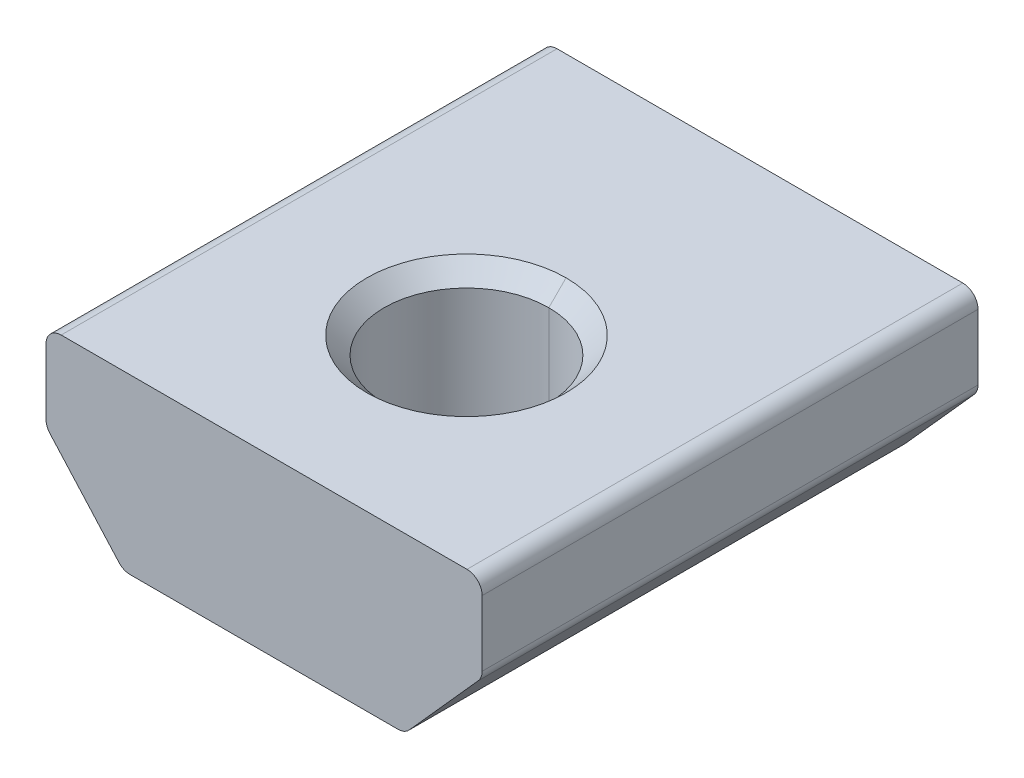
ISO-10303-21;
HEADER;
FILE_DESCRIPTION(('STEP AP214'),'2;1');
FILE_NAME('part.step','',(''),(''),'','','');
FILE_SCHEMA(('AUTOMOTIVE_DESIGN { 1 0 10303 214 1 1 1 1 }'));
ENDSEC;
DATA;
#1=APPLICATION_CONTEXT('core data for automotive mechanical design processes');
#2=APPLICATION_PROTOCOL_DEFINITION('international standard','automotive_design',2000,#1);
#3=PRODUCT_CONTEXT('',#1,'mechanical');
#4=PRODUCT('Part','Part','',(#3));
#5=PRODUCT_RELATED_PRODUCT_CATEGORY('part','',(#4));
#6=PRODUCT_DEFINITION_FORMATION('','',#4);
#7=PRODUCT_DEFINITION_CONTEXT('part definition',#1,'design');
#8=PRODUCT_DEFINITION('design','',#6,#7);
#9=PRODUCT_DEFINITION_SHAPE('','',#8);
#10=(LENGTH_UNIT() NAMED_UNIT(*) SI_UNIT(.MILLI.,.METRE.));
#11=(NAMED_UNIT(*) PLANE_ANGLE_UNIT() SI_UNIT($,.RADIAN.));
#12=(NAMED_UNIT(*) SI_UNIT($,.STERADIAN.) SOLID_ANGLE_UNIT());
#13=UNCERTAINTY_MEASURE_WITH_UNIT(LENGTH_MEASURE(1.E-05),#10,'distance_accuracy_value','');
#14=(GEOMETRIC_REPRESENTATION_CONTEXT(3) GLOBAL_UNCERTAINTY_ASSIGNED_CONTEXT((#13)) GLOBAL_UNIT_ASSIGNED_CONTEXT((#10,
#11,#12)) REPRESENTATION_CONTEXT('',''));
#15=CARTESIAN_POINT('',(0.,0.,0.));
#16=DIRECTION('',(0.,0.,1.));
#17=DIRECTION('',(1.,0.,0.));
#18=AXIS2_PLACEMENT_3D('',#15,#16,#17);
#19=CARTESIAN_POINT('',(5.0927,4.3434,5.08));
#20=DIRECTION('',(0.,-1.,0.));
#21=DIRECTION('',(0.,0.,-1.));
#22=AXIS2_PLACEMENT_3D('',#19,#20,#21);
#23=PLANE('',#22);
#24=CARTESIAN_POINT('',(0.,4.3434,0.));
#25=DIRECTION('',(0.,-1.,0.));
#26=DIRECTION('',(0.,0.,-1.));
#27=AXIS2_PLACEMENT_3D('',#24,#25,#26);
#28=CIRCLE('',#27,2.5);
#29=CARTESIAN_POINT('',(0.,4.3434,-2.5));
#30=VERTEX_POINT('',#29);
#31=CARTESIAN_POINT('',(0.,4.3434,2.5));
#32=VERTEX_POINT('',#31);
#33=EDGE_CURVE('E11',#30,#32,#28,.T.);
#34=ORIENTED_EDGE('',*,*,#33,.T.);
#35=CARTESIAN_POINT('',(0.,4.3434,0.));
#36=DIRECTION('',(0.,-1.,0.));
#37=DIRECTION('',(0.,0.,-1.));
#38=AXIS2_PLACEMENT_3D('',#35,#36,#37);
#39=CIRCLE('',#38,2.5);
#40=EDGE_CURVE('E25',#32,#30,#39,.T.);
#41=ORIENTED_EDGE('',*,*,#40,.T.);
#42=EDGE_LOOP('',(#34,#41));
#43=FACE_BOUND('',#42,.T.);
#44=DIRECTION('',(-1.,0.,0.));
#45=VECTOR('',#44,1.);
#46=CARTESIAN_POINT('',(5.0927,4.3434,-7.366));
#47=LINE('',#46,#45);
#48=CARTESIAN_POINT('',(5.0927,4.3434,-7.366));
#49=VERTEX_POINT('',#48);
#50=CARTESIAN_POINT('',(-5.0927,4.3434,-7.366));
#51=VERTEX_POINT('',#50);
#52=EDGE_CURVE('E356',#49,#51,#47,.T.);
#53=ORIENTED_EDGE('',*,*,#52,.T.);
#54=DIRECTION('',(0.,0.,-1.));
#55=VECTOR('',#54,1.);
#56=CARTESIAN_POINT('',(-5.0927,4.3434,5.08));
#57=LINE('',#56,#55);
#58=CARTESIAN_POINT('',(-5.0927,4.3434,5.08));
#59=VERTEX_POINT('',#58);
#60=EDGE_CURVE('E351',#59,#51,#57,.T.);
#61=ORIENTED_EDGE('',*,*,#60,.F.);
#62=DIRECTION('',(-1.,0.,0.));
#63=VECTOR('',#62,1.);
#64=CARTESIAN_POINT('',(5.0927,4.3434,5.08));
#65=LINE('',#64,#63);
#66=CARTESIAN_POINT('',(5.0927,4.3434,5.08));
#67=VERTEX_POINT('',#66);
#68=EDGE_CURVE('E346',#67,#59,#65,.T.);
#69=ORIENTED_EDGE('',*,*,#68,.F.);
#70=DIRECTION('',(0.,0.,-1.));
#71=VECTOR('',#70,1.);
#72=CARTESIAN_POINT('',(5.0927,4.3434,5.08));
#73=LINE('',#72,#71);
#74=EDGE_CURVE('E342',#67,#49,#73,.T.);
#75=ORIENTED_EDGE('',*,*,#74,.T.);
#76=EDGE_LOOP('',(#53,#61,#69,#75));
#77=FACE_BOUND('',#76,.T.);
#78=ADVANCED_FACE('F17',(#43,#77),#23,.F.);
#79=CARTESIAN_POINT('',(5.09270000000009,3.96240000000009,5.08));
#80=DIRECTION('',(0.,0.,1.));
#81=DIRECTION('',(-0.707106781186547,-0.707106781186548,0.));
#82=AXIS2_PLACEMENT_3D('',#79,#80,#81);
#83=CYLINDRICAL_SURFACE('',#82,0.381);
#84=CARTESIAN_POINT('',(5.09270000000009,3.96240000000009,-7.366));
#85=DIRECTION('',(0.,0.,1.));
#86=DIRECTION('',(1.,0.,0.));
#87=AXIS2_PLACEMENT_3D('',#84,#85,#86);
#88=CIRCLE('',#87,0.381);
#89=CARTESIAN_POINT('',(5.4737,3.9624,-7.366));
#90=VERTEX_POINT('',#89);
#91=EDGE_CURVE('E337',#90,#49,#88,.T.);
#92=ORIENTED_EDGE('',*,*,#91,.T.);
#93=ORIENTED_EDGE('',*,*,#74,.F.);
#94=CARTESIAN_POINT('',(5.09270000000009,3.96240000000009,5.08));
#95=DIRECTION('',(0.,0.,1.));
#96=DIRECTION('',(1.,0.,0.));
#97=AXIS2_PLACEMENT_3D('',#94,#95,#96);
#98=CIRCLE('',#97,0.381);
#99=CARTESIAN_POINT('',(5.4737,3.9624,5.08));
#100=VERTEX_POINT('',#99);
#101=EDGE_CURVE('E332',#100,#67,#98,.T.);
#102=ORIENTED_EDGE('',*,*,#101,.F.);
#103=DIRECTION('',(0.,0.,-1.));
#104=VECTOR('',#103,1.);
#105=CARTESIAN_POINT('',(5.4737,3.9624,5.08));
#106=LINE('',#105,#104);
#107=EDGE_CURVE('E328',#100,#90,#106,.T.);
#108=ORIENTED_EDGE('',*,*,#107,.T.);
#109=EDGE_LOOP('',(#92,#93,#102,#108));
#110=FACE_BOUND('',#109,.T.);
#111=ADVANCED_FACE('F384',(#110),#83,.T.);
#112=CARTESIAN_POINT('',(5.4737,2.3172659511594,5.08));
#113=DIRECTION('',(-1.,0.,0.));
#114=DIRECTION('',(0.,0.,1.));
#115=AXIS2_PLACEMENT_3D('',#112,#113,#114);
#116=PLANE('',#115);
#117=DIRECTION('',(0.,1.,0.));
#118=VECTOR('',#117,1.);
#119=CARTESIAN_POINT('',(5.4737,2.3172659511594,-7.366));
#120=LINE('',#119,#118);
#121=CARTESIAN_POINT('',(5.4737,2.3172659511594,-7.366));
#122=VERTEX_POINT('',#121);
#123=EDGE_CURVE('E323',#122,#90,#120,.T.);
#124=ORIENTED_EDGE('',*,*,#123,.T.);
#125=ORIENTED_EDGE('',*,*,#107,.F.);
#126=DIRECTION('',(0.,1.,0.));
#127=VECTOR('',#126,1.);
#128=CARTESIAN_POINT('',(5.4737,2.3172659511594,5.08));
#129=LINE('',#128,#127);
#130=CARTESIAN_POINT('',(5.4737,2.3172659511594,5.08));
#131=VERTEX_POINT('',#130);
#132=EDGE_CURVE('E318',#131,#100,#129,.T.);
#133=ORIENTED_EDGE('',*,*,#132,.F.);
#134=DIRECTION('',(0.,0.,-1.));
#135=VECTOR('',#134,1.);
#136=CARTESIAN_POINT('',(5.4737,2.3172659511594,5.08));
#137=LINE('',#136,#135);
#138=EDGE_CURVE('E314',#131,#122,#137,.T.);
#139=ORIENTED_EDGE('',*,*,#138,.T.);
#140=EDGE_LOOP('',(#124,#125,#133,#139));
#141=FACE_BOUND('',#140,.T.);
#142=ADVANCED_FACE('F390',(#141),#116,.F.);
#143=CARTESIAN_POINT('',(5.09270000000063,2.31726595115922,5.08));
#144=DIRECTION('',(0.,0.,1.));
#145=DIRECTION('',(-0.934142197565999,0.356901043325129,0.));
#146=AXIS2_PLACEMENT_3D('',#143,#144,#145);
#147=CYLINDRICAL_SURFACE('',#146,0.381);
#148=CARTESIAN_POINT('',(5.09270000000063,2.31726595115922,-7.366));
#149=DIRECTION('',(0.,0.,1.));
#150=DIRECTION('',(1.,0.,0.));
#151=AXIS2_PLACEMENT_3D('',#148,#149,#150);
#152=CIRCLE('',#151,0.381);
#153=CARTESIAN_POINT('',(5.3766376936984,2.0632179515664,-7.366));
#154=VERTEX_POINT('',#153);
#155=EDGE_CURVE('E309',#154,#122,#152,.T.);
#156=ORIENTED_EDGE('',*,*,#155,.T.);
#157=ORIENTED_EDGE('',*,*,#138,.F.);
#158=CARTESIAN_POINT('',(5.09270000000063,2.31726595115922,5.08));
#159=DIRECTION('',(0.,0.,1.));
#160=DIRECTION('',(1.,0.,0.));
#161=AXIS2_PLACEMENT_3D('',#158,#159,#160);
#162=CIRCLE('',#161,0.381);
#163=CARTESIAN_POINT('',(5.3766376936984,2.0632179515664,5.08));
#164=VERTEX_POINT('',#163);
#165=EDGE_CURVE('E304',#164,#131,#162,.T.);
#166=ORIENTED_EDGE('',*,*,#165,.F.);
#167=DIRECTION('',(0.,0.,-1.));
#168=VECTOR('',#167,1.);
#169=CARTESIAN_POINT('',(5.3766376936984,2.0632179515664,5.08));
#170=LINE('',#169,#168);
#171=EDGE_CURVE('E300',#164,#154,#170,.T.);
#172=ORIENTED_EDGE('',*,*,#171,.T.);
#173=EDGE_LOOP('',(#156,#157,#166,#172));
#174=FACE_BOUND('',#173,.T.);
#175=ADVANCED_FACE('F393',(#174),#147,.T.);
#176=CARTESIAN_POINT('',(3.6441995479741,0.12695200040697,5.08));
#177=DIRECTION('',(-0.745243290547055,0.666792649850459,0.));
#178=DIRECTION('',(-0.666792649850459,-0.745243290547055,0.));
#179=AXIS2_PLACEMENT_3D('',#176,#177,#178);
#180=PLANE('',#179);
#181=DIRECTION('',(0.666792649850459,0.745243290547055,0.));
#182=VECTOR('',#181,1.);
#183=CARTESIAN_POINT('',(3.6441995479741,0.12695200040697,-7.366));
#184=LINE('',#183,#182);
#185=CARTESIAN_POINT('',(3.6441995479741,0.12695200040697,-7.366));
#186=VERTEX_POINT('',#185);
#187=EDGE_CURVE('E295',#186,#154,#184,.T.);
#188=ORIENTED_EDGE('',*,*,#187,.T.);
#189=ORIENTED_EDGE('',*,*,#171,.F.);
#190=DIRECTION('',(0.666792649850459,0.745243290547055,0.));
#191=VECTOR('',#190,1.);
#192=CARTESIAN_POINT('',(3.6441995479741,0.12695200040697,5.08));
#193=LINE('',#192,#191);
#194=CARTESIAN_POINT('',(3.6441995479741,0.12695200040697,5.08));
#195=VERTEX_POINT('',#194);
#196=EDGE_CURVE('E290',#195,#164,#193,.T.);
#197=ORIENTED_EDGE('',*,*,#196,.F.);
#198=DIRECTION('',(0.,0.,-1.));
#199=VECTOR('',#198,1.);
#200=CARTESIAN_POINT('',(3.6441995479741,0.12695200040697,5.08));
#201=LINE('',#200,#199);
#202=EDGE_CURVE('E286',#195,#186,#201,.T.);
#203=ORIENTED_EDGE('',*,*,#202,.T.);
#204=EDGE_LOOP('',(#188,#189,#197,#203));
#205=FACE_BOUND('',#204,.T.);
#206=ADVANCED_FACE('F396',(#205),#180,.F.);
#207=CARTESIAN_POINT('',(3.36026185427575,0.380999999999828,5.08));
#208=DIRECTION('',(0.,0.,1.));
#209=DIRECTION('',(-0.408171134543824,0.912905430439105,0.));
#210=AXIS2_PLACEMENT_3D('',#207,#208,#209);
#211=CYLINDRICAL_SURFACE('',#210,0.381);
#212=CARTESIAN_POINT('',(3.36026185427575,0.380999999999828,-7.366));
#213=DIRECTION('',(0.,0.,1.));
#214=DIRECTION('',(1.,0.,0.));
#215=AXIS2_PLACEMENT_3D('',#212,#213,#214);
#216=CIRCLE('',#215,0.381);
#217=CARTESIAN_POINT('',(3.3602618542757,0.,-7.366));
#218=VERTEX_POINT('',#217);
#219=EDGE_CURVE('E281',#218,#186,#216,.T.);
#220=ORIENTED_EDGE('',*,*,#219,.T.);
#221=ORIENTED_EDGE('',*,*,#202,.F.);
#222=CARTESIAN_POINT('',(3.36026185427575,0.380999999999828,5.08));
#223=DIRECTION('',(0.,0.,1.));
#224=DIRECTION('',(1.,0.,0.));
#225=AXIS2_PLACEMENT_3D('',#222,#223,#224);
#226=CIRCLE('',#225,0.381);
#227=CARTESIAN_POINT('',(3.3602618542757,0.,5.08));
#228=VERTEX_POINT('',#227);
#229=EDGE_CURVE('E276',#228,#195,#226,.T.);
#230=ORIENTED_EDGE('',*,*,#229,.F.);
#231=DIRECTION('',(0.,0.,-1.));
#232=VECTOR('',#231,1.);
#233=CARTESIAN_POINT('',(3.3602618542757,0.,5.08));
#234=LINE('',#233,#232);
#235=EDGE_CURVE('E272',#228,#218,#234,.T.);
#236=ORIENTED_EDGE('',*,*,#235,.T.);
#237=EDGE_LOOP('',(#220,#221,#230,#236));
#238=FACE_BOUND('',#237,.T.);
#239=ADVANCED_FACE('F402',(#238),#211,.T.);
#240=CARTESIAN_POINT('',(-3.3602618542757,0.,5.08));
#241=DIRECTION('',(0.,1.,0.));
#242=DIRECTION('',(0.,0.,1.));
#243=AXIS2_PLACEMENT_3D('',#240,#241,#242);
#244=PLANE('',#243);
#245=CARTESIAN_POINT('',(0.,0.,0.));
#246=DIRECTION('',(0.,-1.,0.));
#247=DIRECTION('',(0.,0.,-1.));
#248=AXIS2_PLACEMENT_3D('',#245,#246,#247);
#249=CIRCLE('',#248,2.5);
#250=CARTESIAN_POINT('',(0.,0.,-2.5));
#251=VERTEX_POINT('',#250);
#252=CARTESIAN_POINT('',(0.,1.10494946525819E-12,2.5000000000011));
#253=VERTEX_POINT('',#252);
#254=EDGE_CURVE('E267',#251,#253,#249,.T.);
#255=ORIENTED_EDGE('',*,*,#254,.F.);
#256=CARTESIAN_POINT('',(0.,0.,0.));
#257=DIRECTION('',(0.,-1.,0.));
#258=DIRECTION('',(0.,0.,-1.));
#259=AXIS2_PLACEMENT_3D('',#256,#257,#258);
#260=CIRCLE('',#259,2.5);
#261=EDGE_CURVE('E262',#253,#251,#260,.T.);
#262=ORIENTED_EDGE('',*,*,#261,.F.);
#263=EDGE_LOOP('',(#255,#262));
#264=FACE_BOUND('',#263,.T.);
#265=DIRECTION('',(1.,0.,0.));
#266=VECTOR('',#265,1.);
#267=CARTESIAN_POINT('',(-3.3602618542757,0.,-7.366));
#268=LINE('',#267,#266);
#269=CARTESIAN_POINT('',(-3.3602618542757,0.,-7.366));
#270=VERTEX_POINT('',#269);
#271=EDGE_CURVE('E257',#270,#218,#268,.T.);
#272=ORIENTED_EDGE('',*,*,#271,.T.);
#273=ORIENTED_EDGE('',*,*,#235,.F.);
#274=DIRECTION('',(1.,0.,0.));
#275=VECTOR('',#274,1.);
#276=CARTESIAN_POINT('',(-3.3602618542757,0.,5.08));
#277=LINE('',#276,#275);
#278=CARTESIAN_POINT('',(-3.3602618542757,0.,5.08));
#279=VERTEX_POINT('',#278);
#280=EDGE_CURVE('E252',#279,#228,#277,.T.);
#281=ORIENTED_EDGE('',*,*,#280,.F.);
#282=DIRECTION('',(0.,0.,-1.));
#283=VECTOR('',#282,1.);
#284=CARTESIAN_POINT('',(-3.3602618542757,0.,5.08));
#285=LINE('',#284,#283);
#286=EDGE_CURVE('E248',#279,#270,#285,.T.);
#287=ORIENTED_EDGE('',*,*,#286,.T.);
#288=EDGE_LOOP('',(#272,#273,#281,#287));
#289=FACE_BOUND('',#288,.T.);
#290=ADVANCED_FACE('F405',(#264,#289),#244,.F.);
#291=CARTESIAN_POINT('',(-3.36026185427575,0.380999999999829,5.08));
#292=DIRECTION('',(0.,0.,1.));
#293=DIRECTION('',(0.408171134543822,0.912905430439106,0.));
#294=AXIS2_PLACEMENT_3D('',#291,#292,#293);
#295=CYLINDRICAL_SURFACE('',#294,0.381);
#296=CARTESIAN_POINT('',(-3.36026185427575,0.380999999999829,-7.366));
#297=DIRECTION('',(0.,0.,1.));
#298=DIRECTION('',(1.,0.,0.));
#299=AXIS2_PLACEMENT_3D('',#296,#297,#298);
#300=CIRCLE('',#299,0.381);
#301=CARTESIAN_POINT('',(-3.6441995479741,0.12695200040697,-7.366));
#302=VERTEX_POINT('',#301);
#303=EDGE_CURVE('E243',#302,#270,#300,.T.);
#304=ORIENTED_EDGE('',*,*,#303,.T.);
#305=ORIENTED_EDGE('',*,*,#286,.F.);
#306=CARTESIAN_POINT('',(-3.36026185427575,0.380999999999829,5.08));
#307=DIRECTION('',(0.,0.,1.));
#308=DIRECTION('',(1.,0.,0.));
#309=AXIS2_PLACEMENT_3D('',#306,#307,#308);
#310=CIRCLE('',#309,0.381);
#311=CARTESIAN_POINT('',(-3.6441995479741,0.12695200040697,5.08));
#312=VERTEX_POINT('',#311);
#313=EDGE_CURVE('E238',#312,#279,#310,.T.);
#314=ORIENTED_EDGE('',*,*,#313,.F.);
#315=DIRECTION('',(0.,0.,-1.));
#316=VECTOR('',#315,1.);
#317=CARTESIAN_POINT('',(-3.6441995479741,0.12695200040697,5.08));
#318=LINE('',#317,#316);
#319=EDGE_CURVE('E234',#312,#302,#318,.T.);
#320=ORIENTED_EDGE('',*,*,#319,.T.);
#321=EDGE_LOOP('',(#304,#305,#314,#320));
#322=FACE_BOUND('',#321,.T.);
#323=ADVANCED_FACE('F408',(#322),#295,.T.);
#324=CARTESIAN_POINT('',(-5.3766376936984,2.0632179515664,5.08));
#325=DIRECTION('',(0.745243290547055,0.666792649850459,0.));
#326=DIRECTION('',(-0.666792649850459,0.745243290547055,0.));
#327=AXIS2_PLACEMENT_3D('',#324,#325,#326);
#328=PLANE('',#327);
#329=DIRECTION('',(0.666792649850459,-0.745243290547055,0.));
#330=VECTOR('',#329,1.);
#331=CARTESIAN_POINT('',(-5.3766376936984,2.0632179515664,-7.366));
#332=LINE('',#331,#330);
#333=CARTESIAN_POINT('',(-5.3766376936984,2.0632179515664,-7.366));
#334=VERTEX_POINT('',#333);
#335=EDGE_CURVE('E229',#334,#302,#332,.T.);
#336=ORIENTED_EDGE('',*,*,#335,.T.);
#337=ORIENTED_EDGE('',*,*,#319,.F.);
#338=DIRECTION('',(0.666792649850459,-0.745243290547055,0.));
#339=VECTOR('',#338,1.);
#340=CARTESIAN_POINT('',(-5.3766376936984,2.0632179515664,5.08));
#341=LINE('',#340,#339);
#342=CARTESIAN_POINT('',(-5.3766376936984,2.0632179515664,5.08));
#343=VERTEX_POINT('',#342);
#344=EDGE_CURVE('E224',#343,#312,#341,.T.);
#345=ORIENTED_EDGE('',*,*,#344,.F.);
#346=DIRECTION('',(0.,0.,-1.));
#347=VECTOR('',#346,1.);
#348=CARTESIAN_POINT('',(-5.3766376936984,2.0632179515664,5.08));
#349=LINE('',#348,#347);
#350=EDGE_CURVE('E220',#343,#334,#349,.T.);
#351=ORIENTED_EDGE('',*,*,#350,.T.);
#352=EDGE_LOOP('',(#336,#337,#345,#351));
#353=FACE_BOUND('',#352,.T.);
#354=ADVANCED_FACE('F411',(#353),#328,.F.);
#355=CARTESIAN_POINT('',(-5.09270000000063,2.31726595115922,5.08));
#356=DIRECTION('',(0.,0.,1.));
#357=DIRECTION('',(0.934142197565831,0.35690104332557,0.));
#358=AXIS2_PLACEMENT_3D('',#355,#356,#357);
#359=CYLINDRICAL_SURFACE('',#358,0.381);
#360=CARTESIAN_POINT('',(-5.09270000000063,2.31726595115922,-7.366));
#361=DIRECTION('',(0.,0.,1.));
#362=DIRECTION('',(1.,0.,0.));
#363=AXIS2_PLACEMENT_3D('',#360,#361,#362);
#364=CIRCLE('',#363,0.381);
#365=CARTESIAN_POINT('',(-5.4737,2.3172659511594,-7.366));
#366=VERTEX_POINT('',#365);
#367=EDGE_CURVE('E215',#366,#334,#364,.T.);
#368=ORIENTED_EDGE('',*,*,#367,.T.);
#369=ORIENTED_EDGE('',*,*,#350,.F.);
#370=CARTESIAN_POINT('',(-5.09270000000063,2.31726595115922,5.08));
#371=DIRECTION('',(0.,0.,1.));
#372=DIRECTION('',(1.,0.,0.));
#373=AXIS2_PLACEMENT_3D('',#370,#371,#372);
#374=CIRCLE('',#373,0.381);
#375=CARTESIAN_POINT('',(-5.4737,2.3172659511594,5.08));
#376=VERTEX_POINT('',#375);
#377=EDGE_CURVE('E210',#376,#343,#374,.T.);
#378=ORIENTED_EDGE('',*,*,#377,.F.);
#379=DIRECTION('',(0.,0.,-1.));
#380=VECTOR('',#379,1.);
#381=CARTESIAN_POINT('',(-5.4737,2.3172659511594,5.08));
#382=LINE('',#381,#380);
#383=EDGE_CURVE('E206',#376,#366,#382,.T.);
#384=ORIENTED_EDGE('',*,*,#383,.T.);
#385=EDGE_LOOP('',(#368,#369,#378,#384));
#386=FACE_BOUND('',#385,.T.);
#387=ADVANCED_FACE('F414',(#386),#359,.T.);
#388=CARTESIAN_POINT('',(-5.4737,3.9624,5.08));
#389=DIRECTION('',(1.,0.,0.));
#390=DIRECTION('',(0.,0.,-1.));
#391=AXIS2_PLACEMENT_3D('',#388,#389,#390);
#392=PLANE('',#391);
#393=DIRECTION('',(0.,-1.,0.));
#394=VECTOR('',#393,1.);
#395=CARTESIAN_POINT('',(-5.4737,3.9624,-7.366));
#396=LINE('',#395,#394);
#397=CARTESIAN_POINT('',(-5.4737,3.9624,-7.366));
#398=VERTEX_POINT('',#397);
#399=EDGE_CURVE('E201',#398,#366,#396,.T.);
#400=ORIENTED_EDGE('',*,*,#399,.T.);
#401=ORIENTED_EDGE('',*,*,#383,.F.);
#402=DIRECTION('',(0.,-1.,0.));
#403=VECTOR('',#402,1.);
#404=CARTESIAN_POINT('',(-5.4737,3.9624,5.08));
#405=LINE('',#404,#403);
#406=CARTESIAN_POINT('',(-5.4737,3.9624,5.08));
#407=VERTEX_POINT('',#406);
#408=EDGE_CURVE('E196',#407,#376,#405,.T.);
#409=ORIENTED_EDGE('',*,*,#408,.F.);
#410=DIRECTION('',(0.,0.,-1.));
#411=VECTOR('',#410,1.);
#412=CARTESIAN_POINT('',(-5.4737,3.9624,5.08));
#413=LINE('',#412,#411);
#414=EDGE_CURVE('E192',#407,#398,#413,.T.);
#415=ORIENTED_EDGE('',*,*,#414,.T.);
#416=EDGE_LOOP('',(#400,#401,#409,#415));
#417=FACE_BOUND('',#416,.T.);
#418=ADVANCED_FACE('F380',(#417),#392,.F.);
#419=CARTESIAN_POINT('',(-5.09270000000009,3.96240000000009,5.08));
#420=DIRECTION('',(0.,0.,1.));
#421=DIRECTION('',(0.707106781186547,-0.707106781186549,0.));
#422=AXIS2_PLACEMENT_3D('',#419,#420,#421);
#423=CYLINDRICAL_SURFACE('',#422,0.381);
#424=CARTESIAN_POINT('',(-5.09270000000009,3.96240000000009,-7.366));
#425=DIRECTION('',(0.,0.,1.));
#426=DIRECTION('',(1.,0.,0.));
#427=AXIS2_PLACEMENT_3D('',#424,#425,#426);
#428=CIRCLE('',#427,0.381);
#429=EDGE_CURVE('E187',#51,#398,#428,.T.);
#430=ORIENTED_EDGE('',*,*,#429,.T.);
#431=ORIENTED_EDGE('',*,*,#414,.F.);
#432=CARTESIAN_POINT('',(-5.09270000000009,3.96240000000009,5.08));
#433=DIRECTION('',(0.,0.,1.));
#434=DIRECTION('',(1.,0.,0.));
#435=AXIS2_PLACEMENT_3D('',#432,#433,#434);
#436=CIRCLE('',#435,0.381);
#437=EDGE_CURVE('E182',#59,#407,#436,.T.);
#438=ORIENTED_EDGE('',*,*,#437,.F.);
#439=ORIENTED_EDGE('',*,*,#60,.T.);
#440=EDGE_LOOP('',(#430,#431,#438,#439));
#441=FACE_BOUND('',#440,.T.);
#442=ADVANCED_FACE('F372',(#441),#423,.T.);
#443=CARTESIAN_POINT('',(-5.09270000000009,3.96240000000009,5.08));
#444=DIRECTION('',(0.,0.,1.));
#445=DIRECTION('',(1.,0.,0.));
#446=AXIS2_PLACEMENT_3D('',#443,#444,#445);
#447=PLANE('',#446);
#448=ORIENTED_EDGE('',*,*,#437,.T.);
#449=ORIENTED_EDGE('',*,*,#408,.T.);
#450=ORIENTED_EDGE('',*,*,#377,.T.);
#451=ORIENTED_EDGE('',*,*,#344,.T.);
#452=ORIENTED_EDGE('',*,*,#313,.T.);
#453=ORIENTED_EDGE('',*,*,#280,.T.);
#454=ORIENTED_EDGE('',*,*,#229,.T.);
#455=ORIENTED_EDGE('',*,*,#196,.T.);
#456=ORIENTED_EDGE('',*,*,#165,.T.);
#457=ORIENTED_EDGE('',*,*,#132,.T.);
#458=ORIENTED_EDGE('',*,*,#101,.T.);
#459=ORIENTED_EDGE('',*,*,#68,.T.);
#460=EDGE_LOOP('',(#448,#449,#450,#451,#452,#453,#454,#455,#456,#457,#458,#459));
#461=FACE_BOUND('',#460,.T.);
#462=ADVANCED_FACE('F382',(#461),#447,.T.);
#463=CARTESIAN_POINT('',(-5.09270000000009,3.96240000000009,-7.366));
#464=DIRECTION('',(0.,0.,1.));
#465=DIRECTION('',(1.,0.,0.));
#466=AXIS2_PLACEMENT_3D('',#463,#464,#465);
#467=PLANE('',#466);
#468=ORIENTED_EDGE('',*,*,#429,.F.);
#469=ORIENTED_EDGE('',*,*,#52,.F.);
#470=ORIENTED_EDGE('',*,*,#91,.F.);
#471=ORIENTED_EDGE('',*,*,#123,.F.);
#472=ORIENTED_EDGE('',*,*,#155,.F.);
#473=ORIENTED_EDGE('',*,*,#187,.F.);
#474=ORIENTED_EDGE('',*,*,#219,.F.);
#475=ORIENTED_EDGE('',*,*,#271,.F.);
#476=ORIENTED_EDGE('',*,*,#303,.F.);
#477=ORIENTED_EDGE('',*,*,#335,.F.);
#478=ORIENTED_EDGE('',*,*,#367,.F.);
#479=ORIENTED_EDGE('',*,*,#399,.F.);
#480=EDGE_LOOP('',(#468,#469,#470,#471,#472,#473,#474,#475,#476,#477,#478,#479));
#481=FACE_BOUND('',#480,.T.);
#482=ADVANCED_FACE('F375',(#481),#467,.F.);
#483=CARTESIAN_POINT('',(0.,0.433,0.));
#484=DIRECTION('',(0.,-1.,0.));
#485=DIRECTION('',(1.,0.,0.));
#486=AXIS2_PLACEMENT_3D('',#483,#484,#485);
#487=CONICAL_SURFACE('',#486,2.067,0.7853981634);
#488=CARTESIAN_POINT('',(0.,0.433,0.));
#489=DIRECTION('',(0.,-1.,0.));
#490=DIRECTION('',(0.,0.,-1.));
#491=AXIS2_PLACEMENT_3D('',#488,#489,#490);
#492=CIRCLE('',#491,2.067);
#493=CARTESIAN_POINT('',(0.,0.433,2.067));
#494=VERTEX_POINT('',#493);
#495=CARTESIAN_POINT('',(0.,0.433,-2.067));
#496=VERTEX_POINT('',#495);
#497=EDGE_CURVE('E143',#494,#496,#492,.T.);
#498=ORIENTED_EDGE('',*,*,#497,.F.);
#499=DIRECTION('',(0.,-0.707106781184743,0.707106781188352));
#500=VECTOR('',#499,1.);
#501=CARTESIAN_POINT('',(0.,0.433,2.067));
#502=LINE('',#501,#500);
#503=EDGE_CURVE('E174',#494,#253,#502,.T.);
#504=ORIENTED_EDGE('',*,*,#503,.T.);
#505=ORIENTED_EDGE('',*,*,#261,.T.);
#506=DIRECTION('',(0.,-0.707106781184743,-0.707106781188352));
#507=VECTOR('',#506,1.);
#508=CARTESIAN_POINT('',(0.,0.433,-2.067));
#509=LINE('',#508,#507);
#510=EDGE_CURVE('E169',#496,#251,#509,.T.);
#511=ORIENTED_EDGE('',*,*,#510,.F.);
#512=EDGE_LOOP('',(#498,#504,#505,#511));
#513=FACE_BOUND('',#512,.T.);
#514=ADVANCED_FACE('F490',(#513),#487,.F.);
#515=CARTESIAN_POINT('',(0.,0.433,0.));
#516=DIRECTION('',(0.,-1.,0.));
#517=DIRECTION('',(-1.,0.,0.));
#518=AXIS2_PLACEMENT_3D('',#515,#516,#517);
#519=CONICAL_SURFACE('',#518,2.067,0.7853981634);
#520=ORIENTED_EDGE('',*,*,#254,.T.);
#521=ORIENTED_EDGE('',*,*,#503,.F.);
#522=CARTESIAN_POINT('',(0.,0.433,0.));
#523=DIRECTION('',(0.,-1.,0.));
#524=DIRECTION('',(0.,0.,-1.));
#525=AXIS2_PLACEMENT_3D('',#522,#523,#524);
#526=CIRCLE('',#525,2.067);
#527=EDGE_CURVE('E165',#496,#494,#526,.T.);
#528=ORIENTED_EDGE('',*,*,#527,.F.);
#529=ORIENTED_EDGE('',*,*,#510,.T.);
#530=EDGE_LOOP('',(#520,#521,#528,#529));
#531=FACE_BOUND('',#530,.T.);
#532=ADVANCED_FACE('F499',(#531),#519,.F.);
#533=CARTESIAN_POINT('',(0.,0.,0.));
#534=DIRECTION('',(0.,1.,0.));
#535=DIRECTION('',(-1.,0.,0.));
#536=AXIS2_PLACEMENT_3D('',#533,#534,#535);
#537=CYLINDRICAL_SURFACE('',#536,2.067);
#538=ORIENTED_EDGE('',*,*,#527,.T.);
#539=DIRECTION('',(0.,1.,0.));
#540=VECTOR('',#539,1.);
#541=CARTESIAN_POINT('',(0.,0.433,2.067));
#542=LINE('',#541,#540);
#543=CARTESIAN_POINT('',(0.,3.9104000000011,2.0669999999989));
#544=VERTEX_POINT('',#543);
#545=EDGE_CURVE('E132',#494,#544,#542,.T.);
#546=ORIENTED_EDGE('',*,*,#545,.T.);
#547=CARTESIAN_POINT('',(0.,3.9104,0.));
#548=DIRECTION('',(0.,-1.,0.));
#549=DIRECTION('',(0.,0.,-1.));
#550=AXIS2_PLACEMENT_3D('',#547,#548,#549);
#551=CIRCLE('',#550,2.067);
#552=CARTESIAN_POINT('',(0.,3.9104,-2.067));
#553=VERTEX_POINT('',#552);
#554=EDGE_CURVE('E125',#553,#544,#551,.T.);
#555=ORIENTED_EDGE('',*,*,#554,.F.);
#556=DIRECTION('',(0.,1.,0.));
#557=VECTOR('',#556,1.);
#558=CARTESIAN_POINT('',(0.,0.433,-2.067));
#559=LINE('',#558,#557);
#560=EDGE_CURVE('E129',#496,#553,#559,.T.);
#561=ORIENTED_EDGE('',*,*,#560,.F.);
#562=EDGE_LOOP('',(#538,#546,#555,#561));
#563=FACE_BOUND('',#562,.T.);
#564=ADVANCED_FACE('F128',(#563),#537,.F.);
#565=CARTESIAN_POINT('',(0.,0.,0.));
#566=DIRECTION('',(0.,1.,0.));
#567=DIRECTION('',(1.,0.,0.));
#568=AXIS2_PLACEMENT_3D('',#565,#566,#567);
#569=CYLINDRICAL_SURFACE('',#568,2.067);
#570=CARTESIAN_POINT('',(0.,3.9104,0.));
#571=DIRECTION('',(0.,-1.,0.));
#572=DIRECTION('',(0.,0.,-1.));
#573=AXIS2_PLACEMENT_3D('',#570,#571,#572);
#574=CIRCLE('',#573,2.067);
#575=EDGE_CURVE('E141',#544,#553,#574,.T.);
#576=ORIENTED_EDGE('',*,*,#575,.F.);
#577=ORIENTED_EDGE('',*,*,#545,.F.);
#578=ORIENTED_EDGE('',*,*,#497,.T.);
#579=ORIENTED_EDGE('',*,*,#560,.T.);
#580=EDGE_LOOP('',(#576,#577,#578,#579));
#581=FACE_BOUND('',#580,.T.);
#582=ADVANCED_FACE('F140',(#581),#569,.F.);
#583=CARTESIAN_POINT('',(0.,4.3434,0.));
#584=DIRECTION('',(0.,1.,0.));
#585=DIRECTION('',(1.,0.,0.));
#586=AXIS2_PLACEMENT_3D('',#583,#584,#585);
#587=CONICAL_SURFACE('',#586,2.5,0.7853981634);
#588=ORIENTED_EDGE('',*,*,#40,.F.);
#589=DIRECTION('',(0.,0.707106781184743,0.707106781188352));
#590=VECTOR('',#589,1.);
#591=CARTESIAN_POINT('',(0.,3.9104000000011,2.0669999999989));
#592=LINE('',#591,#590);
#593=EDGE_CURVE('E148',#544,#32,#592,.T.);
#594=ORIENTED_EDGE('',*,*,#593,.F.);
#595=ORIENTED_EDGE('',*,*,#575,.T.);
#596=DIRECTION('',(0.,0.707106781184743,-0.707106781188352));
#597=VECTOR('',#596,1.);
#598=CARTESIAN_POINT('',(0.,3.9104000000011,-2.0669999999989));
#599=LINE('',#598,#597);
#600=EDGE_CURVE('E147',#553,#30,#599,.T.);
#601=ORIENTED_EDGE('',*,*,#600,.T.);
#602=EDGE_LOOP('',(#588,#594,#595,#601));
#603=FACE_BOUND('',#602,.T.);
#604=ADVANCED_FACE('F146',(#603),#587,.F.);
#605=CARTESIAN_POINT('',(0.,4.3434,0.));
#606=DIRECTION('',(0.,1.,0.));
#607=DIRECTION('',(-1.,0.,0.));
#608=AXIS2_PLACEMENT_3D('',#605,#606,#607);
#609=CONICAL_SURFACE('',#608,2.5,0.7853981634);
#610=ORIENTED_EDGE('',*,*,#554,.T.);
#611=ORIENTED_EDGE('',*,*,#593,.T.);
#612=ORIENTED_EDGE('',*,*,#33,.F.);
#613=ORIENTED_EDGE('',*,*,#600,.F.);
#614=EDGE_LOOP('',(#610,#611,#612,#613));
#615=FACE_BOUND('',#614,.T.);
#616=ADVANCED_FACE('F150',(#615),#609,.F.);
#617=CLOSED_SHELL('',(#78,#111,#142,#175,#206,#239,#290,#323,#354,#387,#418,#442,#462,#482,#514,
#532,#564,#582,#604,#616));
#618=MANIFOLD_SOLID_BREP('B1',#617);
#619=ADVANCED_BREP_SHAPE_REPRESENTATION('',(#18,#618),#14);
#620=SHAPE_DEFINITION_REPRESENTATION(#9,#619);
ENDSEC;
END-ISO-10303-21;
